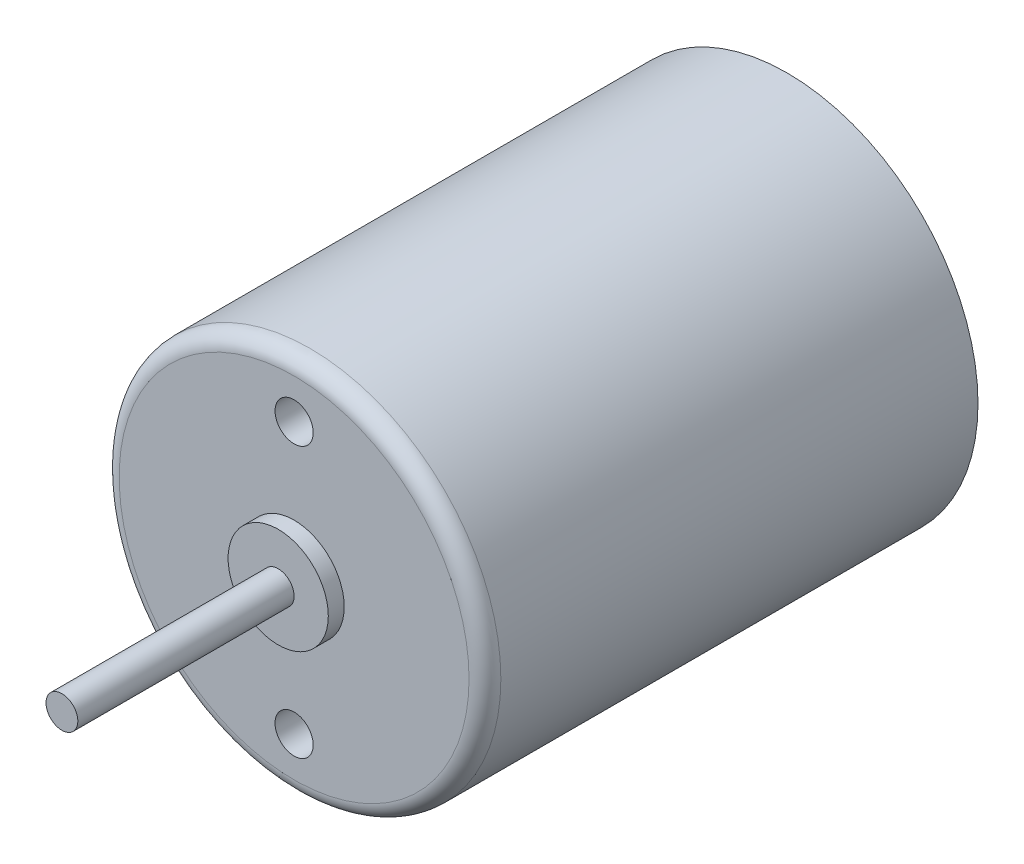
ISO-10303-21;
HEADER;
FILE_DESCRIPTION(('STEP AP214'),'2;1');
FILE_NAME('part.step','',(''),(''),'','','');
FILE_SCHEMA(('AUTOMOTIVE_DESIGN { 1 0 10303 214 1 1 1 1 }'));
ENDSEC;
DATA;
#1=APPLICATION_CONTEXT('core data for automotive mechanical design processes');
#2=APPLICATION_PROTOCOL_DEFINITION('international standard','automotive_design',2000,#1);
#3=PRODUCT_CONTEXT('',#1,'mechanical');
#4=PRODUCT('Part','Part','',(#3));
#5=PRODUCT_RELATED_PRODUCT_CATEGORY('part','',(#4));
#6=PRODUCT_DEFINITION_FORMATION('','',#4);
#7=PRODUCT_DEFINITION_CONTEXT('part definition',#1,'design');
#8=PRODUCT_DEFINITION('design','',#6,#7);
#9=PRODUCT_DEFINITION_SHAPE('','',#8);
#10=(LENGTH_UNIT() NAMED_UNIT(*) SI_UNIT(.MILLI.,.METRE.));
#11=(NAMED_UNIT(*) PLANE_ANGLE_UNIT() SI_UNIT($,.RADIAN.));
#12=(NAMED_UNIT(*) SI_UNIT($,.STERADIAN.) SOLID_ANGLE_UNIT());
#13=UNCERTAINTY_MEASURE_WITH_UNIT(LENGTH_MEASURE(1.E-05),#10,'distance_accuracy_value','');
#14=(GEOMETRIC_REPRESENTATION_CONTEXT(3) GLOBAL_UNCERTAINTY_ASSIGNED_CONTEXT((#13)) GLOBAL_UNIT_ASSIGNED_CONTEXT((#10,
#11,#12)) REPRESENTATION_CONTEXT('',''));
#15=CARTESIAN_POINT('',(0.,0.,0.));
#16=DIRECTION('',(0.,0.,1.));
#17=DIRECTION('',(1.,0.,0.));
#18=AXIS2_PLACEMENT_3D('',#15,#16,#17);
#19=CARTESIAN_POINT('',(0.,0.,31.));
#20=DIRECTION('',(0.,0.,-1.));
#21=DIRECTION('',(-1.,0.,0.));
#22=AXIS2_PLACEMENT_3D('',#19,#20,#21);
#23=CYLINDRICAL_SURFACE('',#22,12.);
#24=CARTESIAN_POINT('',(0.,0.,30.));
#25=DIRECTION('',(0.,0.,1.));
#26=DIRECTION('',(1.,0.,0.));
#27=AXIS2_PLACEMENT_3D('',#24,#25,#26);
#28=CIRCLE('',#27,12.);
#29=CARTESIAN_POINT('',(12.,0.,30.));
#30=VERTEX_POINT('',#29);
#31=EDGE_CURVE('E38',#30,#30,#28,.F.);
#32=ORIENTED_EDGE('',*,*,#31,.T.);
#33=EDGE_LOOP('',(#32));
#34=FACE_BOUND('',#33,.T.);
#35=CARTESIAN_POINT('',(0.,0.,0.));
#36=DIRECTION('',(0.,0.,1.));
#37=DIRECTION('',(1.,0.,0.));
#38=AXIS2_PLACEMENT_3D('',#35,#36,#37);
#39=CIRCLE('',#38,12.);
#40=CARTESIAN_POINT('',(12.,0.,0.));
#41=VERTEX_POINT('',#40);
#42=EDGE_CURVE('E46',#41,#41,#39,.T.);
#43=ORIENTED_EDGE('',*,*,#42,.T.);
#44=EDGE_LOOP('',(#43));
#45=FACE_BOUND('',#44,.T.);
#46=ADVANCED_FACE('F31',(#34,#45),#23,.T.);
#47=CARTESIAN_POINT('',(0.,0.,31.));
#48=DIRECTION('',(0.,0.,1.));
#49=DIRECTION('',(1.,0.,0.));
#50=AXIS2_PLACEMENT_3D('',#47,#48,#49);
#51=PLANE('',#50);
#52=CARTESIAN_POINT('',(0.,8.5,31.));
#53=DIRECTION('',(0.,0.,-1.));
#54=DIRECTION('',(1.,0.,0.));
#55=AXIS2_PLACEMENT_3D('',#52,#53,#54);
#56=CIRCLE('',#55,1.2);
#57=CARTESIAN_POINT('',(1.2,8.5,31.));
#58=VERTEX_POINT('',#57);
#59=EDGE_CURVE('E67',#58,#58,#56,.T.);
#60=ORIENTED_EDGE('',*,*,#59,.T.);
#61=EDGE_LOOP('',(#60));
#62=FACE_BOUND('',#61,.T.);
#63=CARTESIAN_POINT('',(0.,-8.5,31.));
#64=DIRECTION('',(0.,0.,1.));
#65=DIRECTION('',(1.,0.,0.));
#66=AXIS2_PLACEMENT_3D('',#63,#64,#65);
#67=CIRCLE('',#66,1.2);
#68=CARTESIAN_POINT('',(1.2,-8.5,31.));
#69=VERTEX_POINT('',#68);
#70=EDGE_CURVE('E61',#69,#69,#67,.T.);
#71=ORIENTED_EDGE('',*,*,#70,.F.);
#72=EDGE_LOOP('',(#71));
#73=FACE_BOUND('',#72,.T.);
#74=CARTESIAN_POINT('',(0.,0.,31.));
#75=DIRECTION('',(0.,0.,1.));
#76=DIRECTION('',(1.,0.,0.));
#77=AXIS2_PLACEMENT_3D('',#74,#75,#76);
#78=CIRCLE('',#77,3.15);
#79=CARTESIAN_POINT('',(3.15,0.,31.));
#80=VERTEX_POINT('',#79);
#81=EDGE_CURVE('E52',#80,#80,#78,.T.);
#82=ORIENTED_EDGE('',*,*,#81,.F.);
#83=EDGE_LOOP('',(#82));
#84=FACE_BOUND('',#83,.T.);
#85=CARTESIAN_POINT('',(0.,0.,31.));
#86=DIRECTION('',(0.,0.,1.));
#87=DIRECTION('',(1.,0.,0.));
#88=AXIS2_PLACEMENT_3D('',#85,#86,#87);
#89=CIRCLE('',#88,11.);
#90=CARTESIAN_POINT('',(11.,0.,31.));
#91=VERTEX_POINT('',#90);
#92=EDGE_CURVE('E42',#91,#91,#89,.T.);
#93=ORIENTED_EDGE('',*,*,#92,.T.);
#94=EDGE_LOOP('',(#93));
#95=FACE_BOUND('',#94,.T.);
#96=ADVANCED_FACE('F85',(#62,#73,#84,#95),#51,.T.);
#97=CARTESIAN_POINT('',(0.,0.,0.));
#98=DIRECTION('',(0.,0.,1.));
#99=DIRECTION('',(1.,0.,0.));
#100=AXIS2_PLACEMENT_3D('',#97,#98,#99);
#101=PLANE('',#100);
#102=ORIENTED_EDGE('',*,*,#42,.F.);
#103=EDGE_LOOP('',(#102));
#104=FACE_BOUND('',#103,.T.);
#105=ADVANCED_FACE('F89',(#104),#101,.F.);
#106=CARTESIAN_POINT('',(0.,0.,30.));
#107=DIRECTION('',(0.,0.,1.));
#108=DIRECTION('',(1.,0.,0.));
#109=AXIS2_PLACEMENT_3D('',#106,#107,#108);
#110=TOROIDAL_SURFACE('',#109,11.,1.);
#111=ORIENTED_EDGE('',*,*,#31,.F.);
#112=EDGE_LOOP('',(#111));
#113=FACE_BOUND('',#112,.T.);
#114=ORIENTED_EDGE('',*,*,#92,.F.);
#115=EDGE_LOOP('',(#114));
#116=FACE_BOUND('',#115,.T.);
#117=ADVANCED_FACE('F33',(#113,#116),#110,.T.);
#118=CARTESIAN_POINT('',(0.,0.,32.));
#119=DIRECTION('',(0.,0.,-1.));
#120=DIRECTION('',(-1.,0.,0.));
#121=AXIS2_PLACEMENT_3D('',#118,#119,#120);
#122=CYLINDRICAL_SURFACE('',#121,3.15);
#123=CARTESIAN_POINT('',(0.,0.,32.));
#124=DIRECTION('',(0.,0.,1.));
#125=DIRECTION('',(1.,0.,0.));
#126=AXIS2_PLACEMENT_3D('',#123,#124,#125);
#127=CIRCLE('',#126,3.15);
#128=CARTESIAN_POINT('',(3.15,0.,32.));
#129=VERTEX_POINT('',#128);
#130=EDGE_CURVE('E51',#129,#129,#127,.T.);
#131=ORIENTED_EDGE('',*,*,#130,.F.);
#132=EDGE_LOOP('',(#131));
#133=FACE_BOUND('',#132,.T.);
#134=ORIENTED_EDGE('',*,*,#81,.T.);
#135=EDGE_LOOP('',(#134));
#136=FACE_BOUND('',#135,.T.);
#137=ADVANCED_FACE('F97',(#133,#136),#122,.T.);
#138=CARTESIAN_POINT('',(0.,0.,32.));
#139=DIRECTION('',(0.,0.,1.));
#140=DIRECTION('',(1.,0.,0.));
#141=AXIS2_PLACEMENT_3D('',#138,#139,#140);
#142=PLANE('',#141);
#143=CARTESIAN_POINT('',(0.,0.,32.));
#144=DIRECTION('',(0.,0.,1.));
#145=DIRECTION('',(1.,0.,0.));
#146=AXIS2_PLACEMENT_3D('',#143,#144,#145);
#147=CIRCLE('',#146,1.);
#148=CARTESIAN_POINT('',(1.,0.,32.));
#149=VERTEX_POINT('',#148);
#150=EDGE_CURVE('E10',#149,#149,#147,.T.);
#151=ORIENTED_EDGE('',*,*,#150,.F.);
#152=EDGE_LOOP('',(#151));
#153=FACE_BOUND('',#152,.T.);
#154=ORIENTED_EDGE('',*,*,#130,.T.);
#155=EDGE_LOOP('',(#154));
#156=FACE_BOUND('',#155,.T.);
#157=ADVANCED_FACE('F100',(#153,#156),#142,.T.);
#158=CARTESIAN_POINT('',(0.,0.,45.6));
#159=DIRECTION('',(0.,0.,-1.));
#160=DIRECTION('',(-1.,0.,0.));
#161=AXIS2_PLACEMENT_3D('',#158,#159,#160);
#162=CYLINDRICAL_SURFACE('',#161,1.);
#163=ORIENTED_EDGE('',*,*,#150,.T.);
#164=EDGE_LOOP('',(#163));
#165=FACE_BOUND('',#164,.T.);
#166=CARTESIAN_POINT('',(0.,0.,45.6));
#167=DIRECTION('',(0.,0.,-1.));
#168=DIRECTION('',(-1.,0.,0.));
#169=AXIS2_PLACEMENT_3D('',#166,#167,#168);
#170=CIRCLE('',#169,1.);
#171=CARTESIAN_POINT('',(-1.,0.,45.6));
#172=VERTEX_POINT('',#171);
#173=EDGE_CURVE('E55',#172,#172,#170,.T.);
#174=ORIENTED_EDGE('',*,*,#173,.T.);
#175=EDGE_LOOP('',(#174));
#176=FACE_BOUND('',#175,.T.);
#177=ADVANCED_FACE('F104',(#165,#176),#162,.T.);
#178=CARTESIAN_POINT('',(0.,0.,45.6));
#179=DIRECTION('',(0.,0.,-1.));
#180=DIRECTION('',(-1.,0.,0.));
#181=AXIS2_PLACEMENT_3D('',#178,#179,#180);
#182=PLANE('',#181);
#183=ORIENTED_EDGE('',*,*,#173,.F.);
#184=EDGE_LOOP('',(#183));
#185=FACE_BOUND('',#184,.T.);
#186=ADVANCED_FACE('F108',(#185),#182,.F.);
#187=CARTESIAN_POINT('',(0.,-8.5,28.));
#188=DIRECTION('',(0.,0.,1.));
#189=DIRECTION('',(1.,0.,0.));
#190=AXIS2_PLACEMENT_3D('',#187,#188,#189);
#191=CYLINDRICAL_SURFACE('',#190,1.2);
#192=CARTESIAN_POINT('',(0.,-8.5,28.));
#193=DIRECTION('',(0.,0.,1.));
#194=DIRECTION('',(1.,0.,0.));
#195=AXIS2_PLACEMENT_3D('',#192,#193,#194);
#196=CIRCLE('',#195,1.2);
#197=CARTESIAN_POINT('',(1.2,-8.5,28.));
#198=VERTEX_POINT('',#197);
#199=EDGE_CURVE('E60',#198,#198,#196,.T.);
#200=ORIENTED_EDGE('',*,*,#199,.F.);
#201=EDGE_LOOP('',(#200));
#202=FACE_BOUND('',#201,.T.);
#203=ORIENTED_EDGE('',*,*,#70,.T.);
#204=EDGE_LOOP('',(#203));
#205=FACE_BOUND('',#204,.T.);
#206=ADVANCED_FACE('F111',(#202,#205),#191,.F.);
#207=CARTESIAN_POINT('',(0.,-8.5,28.));
#208=DIRECTION('',(0.,0.,1.));
#209=DIRECTION('',(1.,0.,0.));
#210=AXIS2_PLACEMENT_3D('',#207,#208,#209);
#211=PLANE('',#210);
#212=ORIENTED_EDGE('',*,*,#199,.T.);
#213=EDGE_LOOP('',(#212));
#214=FACE_BOUND('',#213,.T.);
#215=ADVANCED_FACE('F82',(#214),#211,.T.);
#216=CARTESIAN_POINT('',(0.,8.5,28.));
#217=DIRECTION('',(0.,0.,1.));
#218=DIRECTION('',(1.,0.,0.));
#219=AXIS2_PLACEMENT_3D('',#216,#217,#218);
#220=CYLINDRICAL_SURFACE('',#219,1.2);
#221=CARTESIAN_POINT('',(0.,8.5,28.));
#222=DIRECTION('',(0.,0.,-1.));
#223=DIRECTION('',(1.,0.,0.));
#224=AXIS2_PLACEMENT_3D('',#221,#222,#223);
#225=CIRCLE('',#224,1.2);
#226=CARTESIAN_POINT('',(1.2,8.5,28.));
#227=VERTEX_POINT('',#226);
#228=EDGE_CURVE('E64',#227,#227,#225,.T.);
#229=ORIENTED_EDGE('',*,*,#228,.T.);
#230=EDGE_LOOP('',(#229));
#231=FACE_BOUND('',#230,.T.);
#232=ORIENTED_EDGE('',*,*,#59,.F.);
#233=EDGE_LOOP('',(#232));
#234=FACE_BOUND('',#233,.T.);
#235=ADVANCED_FACE('F73',(#231,#234),#220,.F.);
#236=CARTESIAN_POINT('',(0.,8.5,28.));
#237=DIRECTION('',(0.,0.,1.));
#238=DIRECTION('',(1.,0.,0.));
#239=AXIS2_PLACEMENT_3D('',#236,#237,#238);
#240=PLANE('',#239);
#241=ORIENTED_EDGE('',*,*,#228,.F.);
#242=EDGE_LOOP('',(#241));
#243=FACE_BOUND('',#242,.T.);
#244=ADVANCED_FACE('F76',(#243),#240,.T.);
#245=CLOSED_SHELL('',(#46,#96,#105,#117,#137,#157,#177,#186,#206,#215,#235,#244));
#246=MANIFOLD_SOLID_BREP('B2',#245);
#247=ADVANCED_BREP_SHAPE_REPRESENTATION('',(#18,#246),#14);
#248=SHAPE_DEFINITION_REPRESENTATION(#9,#247);
ENDSEC;
END-ISO-10303-21;
